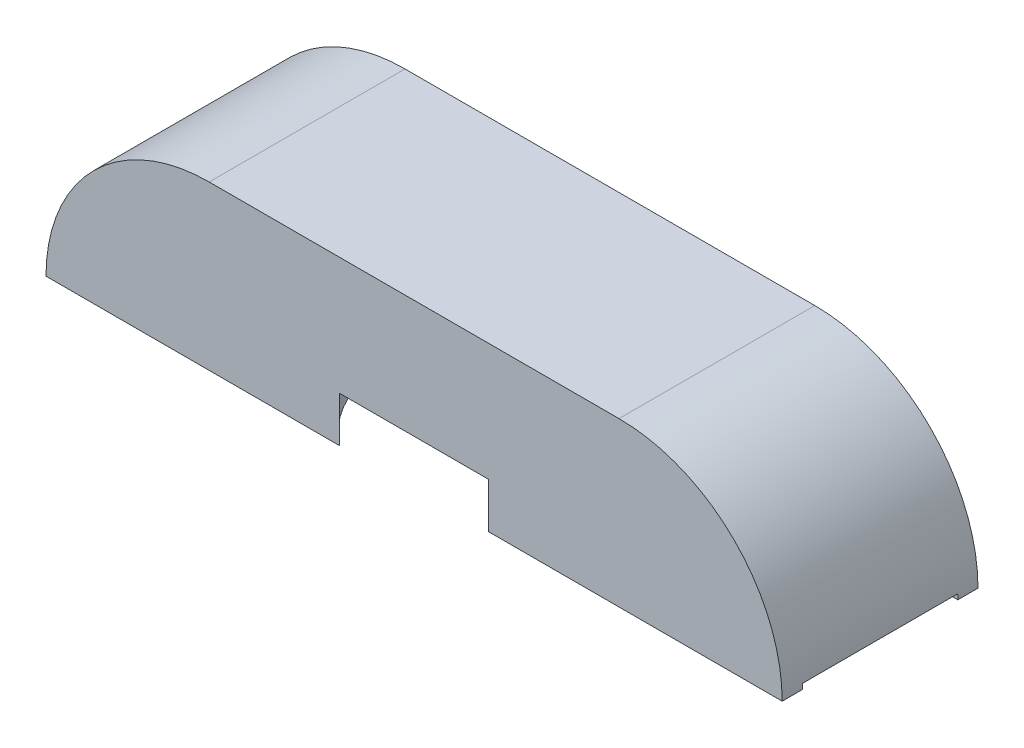
ISO-10303-21;
HEADER;
FILE_DESCRIPTION(('STEP AP214'),'2;1');
FILE_NAME('part.step','',(''),(''),'','','');
FILE_SCHEMA(('AUTOMOTIVE_DESIGN { 1 0 10303 214 1 1 1 1 }'));
ENDSEC;
DATA;
#1=APPLICATION_CONTEXT('core data for automotive mechanical design processes');
#2=APPLICATION_PROTOCOL_DEFINITION('international standard','automotive_design',2000,#1);
#3=PRODUCT_CONTEXT('',#1,'mechanical');
#4=PRODUCT('Part','Part','',(#3));
#5=PRODUCT_RELATED_PRODUCT_CATEGORY('part','',(#4));
#6=PRODUCT_DEFINITION_FORMATION('','',#4);
#7=PRODUCT_DEFINITION_CONTEXT('part definition',#1,'design');
#8=PRODUCT_DEFINITION('design','',#6,#7);
#9=PRODUCT_DEFINITION_SHAPE('','',#8);
#10=(LENGTH_UNIT() NAMED_UNIT(*) SI_UNIT(.MILLI.,.METRE.));
#11=(NAMED_UNIT(*) PLANE_ANGLE_UNIT() SI_UNIT($,.RADIAN.));
#12=(NAMED_UNIT(*) SI_UNIT($,.STERADIAN.) SOLID_ANGLE_UNIT());
#13=UNCERTAINTY_MEASURE_WITH_UNIT(LENGTH_MEASURE(1.E-05),#10,'distance_accuracy_value','');
#14=(GEOMETRIC_REPRESENTATION_CONTEXT(3) GLOBAL_UNCERTAINTY_ASSIGNED_CONTEXT((#13)) GLOBAL_UNIT_ASSIGNED_CONTEXT((#10,
#11,#12)) REPRESENTATION_CONTEXT('',''));
#15=CARTESIAN_POINT('',(0.,0.,0.));
#16=DIRECTION('',(0.,0.,1.));
#17=DIRECTION('',(1.,0.,0.));
#18=AXIS2_PLACEMENT_3D('',#15,#16,#17);
#19=CARTESIAN_POINT('',(0.,0.,0.));
#20=DIRECTION('',(0.,1.,0.));
#21=DIRECTION('',(0.,0.,1.));
#22=AXIS2_PLACEMENT_3D('',#19,#20,#21);
#23=PLANE('',#22);
#24=DIRECTION('',(1.,0.,0.));
#25=VECTOR('',#24,1.);
#26=CARTESIAN_POINT('',(-45.115,0.,12.));
#27=LINE('',#26,#25);
#28=CARTESIAN_POINT('',(9.1327104410465,0.,12.));
#29=VERTEX_POINT('',#28);
#30=CARTESIAN_POINT('',(45.115,0.,12.));
#31=VERTEX_POINT('',#30);
#32=EDGE_CURVE('E237',#29,#31,#27,.T.);
#33=ORIENTED_EDGE('',*,*,#32,.F.);
#34=CARTESIAN_POINT('',(0.,0.,0.));
#35=DIRECTION('',(0.,-1.,0.));
#36=DIRECTION('',(0.,0.,-1.));
#37=AXIS2_PLACEMENT_3D('',#34,#35,#36);
#38=CIRCLE('',#37,15.08);
#39=CARTESIAN_POINT('',(9.13271044104651,0.,-12.));
#40=VERTEX_POINT('',#39);
#41=EDGE_CURVE('E295',#40,#29,#38,.T.);
#42=ORIENTED_EDGE('',*,*,#41,.F.);
#43=DIRECTION('',(-1.,0.,0.));
#44=VECTOR('',#43,1.);
#45=CARTESIAN_POINT('',(-45.115,0.,-12.));
#46=LINE('',#45,#44);
#47=CARTESIAN_POINT('',(45.115,0.,-12.));
#48=VERTEX_POINT('',#47);
#49=EDGE_CURVE('E166',#48,#40,#46,.T.);
#50=ORIENTED_EDGE('',*,*,#49,.F.);
#51=DIRECTION('',(0.,0.,-1.));
#52=VECTOR('',#51,1.);
#53=CARTESIAN_POINT('',(45.115,0.,-12.));
#54=LINE('',#53,#52);
#55=CARTESIAN_POINT('',(45.115,0.,-9.525));
#56=VERTEX_POINT('',#55);
#57=EDGE_CURVE('E213',#56,#48,#54,.T.);
#58=ORIENTED_EDGE('',*,*,#57,.F.);
#59=DIRECTION('',(1.,0.,0.));
#60=VECTOR('',#59,1.);
#61=CARTESIAN_POINT('',(45.115,0.,-9.525));
#62=LINE('',#61,#60);
#63=CARTESIAN_POINT('',(38.635,0.,-9.525));
#64=VERTEX_POINT('',#63);
#65=EDGE_CURVE('E195',#64,#56,#62,.T.);
#66=ORIENTED_EDGE('',*,*,#65,.F.);
#67=DIRECTION('',(0.,0.,-1.));
#68=VECTOR('',#67,1.);
#69=CARTESIAN_POINT('',(38.635,0.,9.525));
#70=LINE('',#69,#68);
#71=CARTESIAN_POINT('',(38.635,0.,9.525));
#72=VERTEX_POINT('',#71);
#73=EDGE_CURVE('E204',#72,#64,#70,.T.);
#74=ORIENTED_EDGE('',*,*,#73,.F.);
#75=DIRECTION('',(-1.,0.,0.));
#76=VECTOR('',#75,1.);
#77=CARTESIAN_POINT('',(45.115,0.,9.525));
#78=LINE('',#77,#76);
#79=CARTESIAN_POINT('',(45.115,0.,9.525));
#80=VERTEX_POINT('',#79);
#81=EDGE_CURVE('E190',#80,#72,#78,.T.);
#82=ORIENTED_EDGE('',*,*,#81,.F.);
#83=EDGE_CURVE('E226',#31,#80,#54,.T.);
#84=ORIENTED_EDGE('',*,*,#83,.F.);
#85=EDGE_LOOP('',(#33,#42,#50,#58,#66,#74,#82,#84));
#86=FACE_BOUND('',#85,.T.);
#87=ADVANCED_FACE('F43',(#86),#23,.F.);
#88=CARTESIAN_POINT('',(-45.115,20.,-12.));
#89=DIRECTION('',(0.,0.,1.));
#90=DIRECTION('',(1.,0.,0.));
#91=AXIS2_PLACEMENT_3D('',#88,#89,#90);
#92=PLANE('',#91);
#93=DIRECTION('',(1.,0.,0.));
#94=VECTOR('',#93,1.);
#95=CARTESIAN_POINT('',(-45.115,5.56,-12.));
#96=LINE('',#95,#94);
#97=CARTESIAN_POINT('',(-9.13271044104651,5.56,-12.));
#98=VERTEX_POINT('',#97);
#99=CARTESIAN_POINT('',(9.13271044104651,5.56,-12.));
#100=VERTEX_POINT('',#99);
#101=EDGE_CURVE('E141',#98,#100,#96,.T.);
#102=ORIENTED_EDGE('',*,*,#101,.F.);
#103=DIRECTION('',(0.,-1.,0.));
#104=VECTOR('',#103,1.);
#105=CARTESIAN_POINT('',(-9.13271044104651,5.56,-12.));
#106=LINE('',#105,#104);
#107=CARTESIAN_POINT('',(-9.13271044104651,0.,-12.));
#108=VERTEX_POINT('',#107);
#109=EDGE_CURVE('E152',#98,#108,#106,.T.);
#110=ORIENTED_EDGE('',*,*,#109,.T.);
#111=CARTESIAN_POINT('',(-45.115,0.,-12.));
#112=VERTEX_POINT('',#111);
#113=EDGE_CURVE('E230',#108,#112,#46,.T.);
#114=ORIENTED_EDGE('',*,*,#113,.T.);
#115=CARTESIAN_POINT('',(-25.115,0.,-12.));
#116=DIRECTION('',(0.,0.,1.));
#117=DIRECTION('',(1.,0.,0.));
#118=AXIS2_PLACEMENT_3D('',#115,#116,#117);
#119=CIRCLE('',#118,20.);
#120=CARTESIAN_POINT('',(-25.115,20.,-12.));
#121=VERTEX_POINT('',#120);
#122=EDGE_CURVE('E248',#112,#121,#119,.F.);
#123=ORIENTED_EDGE('',*,*,#122,.T.);
#124=DIRECTION('',(-1.,0.,0.));
#125=VECTOR('',#124,1.);
#126=CARTESIAN_POINT('',(-45.115,20.,-12.));
#127=LINE('',#126,#125);
#128=CARTESIAN_POINT('',(25.115,20.,-12.));
#129=VERTEX_POINT('',#128);
#130=EDGE_CURVE('E216',#129,#121,#127,.T.);
#131=ORIENTED_EDGE('',*,*,#130,.F.);
#132=CARTESIAN_POINT('',(25.115,0.,-12.));
#133=DIRECTION('',(0.,0.,1.));
#134=DIRECTION('',(1.,0.,0.));
#135=AXIS2_PLACEMENT_3D('',#132,#133,#134);
#136=CIRCLE('',#135,20.);
#137=EDGE_CURVE('E251',#129,#48,#136,.F.);
#138=ORIENTED_EDGE('',*,*,#137,.T.);
#139=ORIENTED_EDGE('',*,*,#49,.T.);
#140=DIRECTION('',(0.,-1.,0.));
#141=VECTOR('',#140,1.);
#142=CARTESIAN_POINT('',(9.13271044104651,5.56,-12.));
#143=LINE('',#142,#141);
#144=EDGE_CURVE('E156',#40,#100,#143,.F.);
#145=ORIENTED_EDGE('',*,*,#144,.T.);
#146=EDGE_LOOP('',(#102,#110,#114,#123,#131,#138,#139,#145));
#147=FACE_BOUND('',#146,.T.);
#148=ADVANCED_FACE('F163',(#147),#92,.F.);
#149=CARTESIAN_POINT('',(-45.115,20.,12.));
#150=DIRECTION('',(0.,0.,-1.));
#151=DIRECTION('',(-1.,0.,0.));
#152=AXIS2_PLACEMENT_3D('',#149,#150,#151);
#153=PLANE('',#152);
#154=DIRECTION('',(-1.,0.,0.));
#155=VECTOR('',#154,1.);
#156=CARTESIAN_POINT('',(-45.115,5.56,12.));
#157=LINE('',#156,#155);
#158=CARTESIAN_POINT('',(9.1327104410465,5.56,12.));
#159=VERTEX_POINT('',#158);
#160=CARTESIAN_POINT('',(-9.1327104410465,5.56,12.));
#161=VERTEX_POINT('',#160);
#162=EDGE_CURVE('E11',#159,#161,#157,.T.);
#163=ORIENTED_EDGE('',*,*,#162,.F.);
#164=DIRECTION('',(0.,-1.,0.));
#165=VECTOR('',#164,1.);
#166=CARTESIAN_POINT('',(9.1327104410465,5.56,12.));
#167=LINE('',#166,#165);
#168=EDGE_CURVE('E159',#159,#29,#167,.T.);
#169=ORIENTED_EDGE('',*,*,#168,.T.);
#170=ORIENTED_EDGE('',*,*,#32,.T.);
#171=CARTESIAN_POINT('',(25.115,0.,12.));
#172=DIRECTION('',(0.,0.,-1.));
#173=DIRECTION('',(-1.,0.,0.));
#174=AXIS2_PLACEMENT_3D('',#171,#172,#173);
#175=CIRCLE('',#174,20.);
#176=CARTESIAN_POINT('',(25.115,20.,12.));
#177=VERTEX_POINT('',#176);
#178=EDGE_CURVE('E257',#31,#177,#175,.F.);
#179=ORIENTED_EDGE('',*,*,#178,.T.);
#180=DIRECTION('',(1.,0.,0.));
#181=VECTOR('',#180,1.);
#182=CARTESIAN_POINT('',(-45.115,20.,12.));
#183=LINE('',#182,#181);
#184=CARTESIAN_POINT('',(-25.115,20.,12.));
#185=VERTEX_POINT('',#184);
#186=EDGE_CURVE('E220',#185,#177,#183,.T.);
#187=ORIENTED_EDGE('',*,*,#186,.F.);
#188=CARTESIAN_POINT('',(-25.115,0.,12.));
#189=DIRECTION('',(0.,0.,-1.));
#190=DIRECTION('',(-1.,0.,0.));
#191=AXIS2_PLACEMENT_3D('',#188,#189,#190);
#192=CIRCLE('',#191,20.);
#193=CARTESIAN_POINT('',(-45.115,0.,12.));
#194=VERTEX_POINT('',#193);
#195=EDGE_CURVE('E254',#185,#194,#192,.F.);
#196=ORIENTED_EDGE('',*,*,#195,.T.);
#197=CARTESIAN_POINT('',(-9.1327104410465,0.,12.));
#198=VERTEX_POINT('',#197);
#199=EDGE_CURVE('E221',#194,#198,#27,.T.);
#200=ORIENTED_EDGE('',*,*,#199,.T.);
#201=DIRECTION('',(0.,-1.,0.));
#202=VECTOR('',#201,1.);
#203=CARTESIAN_POINT('',(-9.1327104410465,5.56,12.));
#204=LINE('',#203,#202);
#205=EDGE_CURVE('E59',#198,#161,#204,.F.);
#206=ORIENTED_EDGE('',*,*,#205,.T.);
#207=EDGE_LOOP('',(#163,#169,#170,#179,#187,#196,#200,#206));
#208=FACE_BOUND('',#207,.T.);
#209=ADVANCED_FACE('F275',(#208),#153,.F.);
#210=CARTESIAN_POINT('',(0.,20.,0.));
#211=DIRECTION('',(0.,1.,0.));
#212=DIRECTION('',(0.,0.,1.));
#213=AXIS2_PLACEMENT_3D('',#210,#211,#212);
#214=PLANE('',#213);
#215=ORIENTED_EDGE('',*,*,#186,.T.);
#216=DIRECTION('',(0.,0.,-1.));
#217=VECTOR('',#216,1.);
#218=CARTESIAN_POINT('',(25.115,20.,-12.));
#219=LINE('',#218,#217);
#220=EDGE_CURVE('E244',#177,#129,#219,.T.);
#221=ORIENTED_EDGE('',*,*,#220,.T.);
#222=ORIENTED_EDGE('',*,*,#130,.T.);
#223=DIRECTION('',(0.,0.,1.));
#224=VECTOR('',#223,1.);
#225=CARTESIAN_POINT('',(-25.115,20.,12.));
#226=LINE('',#225,#224);
#227=EDGE_CURVE('E225',#121,#185,#226,.T.);
#228=ORIENTED_EDGE('',*,*,#227,.T.);
#229=EDGE_LOOP('',(#215,#221,#222,#228));
#230=FACE_BOUND('',#229,.T.);
#231=ADVANCED_FACE('F281',(#230),#214,.T.);
#232=ORIENTED_EDGE('',*,*,#113,.F.);
#233=CARTESIAN_POINT('',(0.,0.,0.));
#234=DIRECTION('',(0.,1.,0.));
#235=DIRECTION('',(0.,0.,1.));
#236=AXIS2_PLACEMENT_3D('',#233,#234,#235);
#237=CIRCLE('',#236,15.08);
#238=EDGE_CURVE('E52',#108,#198,#237,.T.);
#239=ORIENTED_EDGE('',*,*,#238,.T.);
#240=ORIENTED_EDGE('',*,*,#199,.F.);
#241=DIRECTION('',(0.,0.,1.));
#242=VECTOR('',#241,1.);
#243=CARTESIAN_POINT('',(-45.115,0.,-12.));
#244=LINE('',#243,#242);
#245=EDGE_CURVE('E233',#112,#194,#244,.T.);
#246=ORIENTED_EDGE('',*,*,#245,.F.);
#247=EDGE_LOOP('',(#232,#239,#240,#246));
#248=FACE_BOUND('',#247,.T.);
#249=ADVANCED_FACE('F272',(#248),#23,.F.);
#250=CARTESIAN_POINT('',(25.115,0.,0.));
#251=DIRECTION('',(0.,0.,1.));
#252=DIRECTION('',(1.,0.,0.));
#253=AXIS2_PLACEMENT_3D('',#250,#251,#252);
#254=CYLINDRICAL_SURFACE('',#253,20.);
#255=CARTESIAN_POINT('',(25.115,0.,-9.52500000000001));
#256=DIRECTION('',(0.,0.,-1.));
#257=DIRECTION('',(-1.,0.,0.));
#258=AXIS2_PLACEMENT_3D('',#255,#256,#257);
#259=CIRCLE('',#258,20.);
#260=CARTESIAN_POINT('',(45.1047573772169,0.64,-9.525));
#261=VERTEX_POINT('',#260);
#262=EDGE_CURVE('E266',#56,#261,#259,.F.);
#263=ORIENTED_EDGE('',*,*,#262,.F.);
#264=ORIENTED_EDGE('',*,*,#57,.T.);
#265=ORIENTED_EDGE('',*,*,#137,.F.);
#266=ORIENTED_EDGE('',*,*,#220,.F.);
#267=ORIENTED_EDGE('',*,*,#178,.F.);
#268=ORIENTED_EDGE('',*,*,#83,.T.);
#269=CARTESIAN_POINT('',(25.115,0.,9.525));
#270=DIRECTION('',(0.,0.,1.));
#271=DIRECTION('',(1.,0.,0.));
#272=AXIS2_PLACEMENT_3D('',#269,#270,#271);
#273=CIRCLE('',#272,20.);
#274=CARTESIAN_POINT('',(45.1047573772169,0.64,9.525));
#275=VERTEX_POINT('',#274);
#276=EDGE_CURVE('E263',#275,#80,#273,.F.);
#277=ORIENTED_EDGE('',*,*,#276,.F.);
#278=DIRECTION('',(0.,0.,1.));
#279=VECTOR('',#278,1.);
#280=CARTESIAN_POINT('',(45.1047573772169,0.64,0.));
#281=LINE('',#280,#279);
#282=EDGE_CURVE('E260',#261,#275,#281,.T.);
#283=ORIENTED_EDGE('',*,*,#282,.F.);
#284=EDGE_LOOP('',(#263,#264,#265,#266,#267,#268,#277,#283));
#285=FACE_BOUND('',#284,.T.);
#286=ADVANCED_FACE('F289',(#285),#254,.T.);
#287=CARTESIAN_POINT('',(-25.115,0.,0.));
#288=DIRECTION('',(0.,0.,-1.));
#289=DIRECTION('',(-1.,0.,0.));
#290=AXIS2_PLACEMENT_3D('',#287,#288,#289);
#291=CYLINDRICAL_SURFACE('',#290,20.);
#292=ORIENTED_EDGE('',*,*,#122,.F.);
#293=ORIENTED_EDGE('',*,*,#245,.T.);
#294=ORIENTED_EDGE('',*,*,#195,.F.);
#295=ORIENTED_EDGE('',*,*,#227,.F.);
#296=EDGE_LOOP('',(#292,#293,#294,#295));
#297=FACE_BOUND('',#296,.T.);
#298=ADVANCED_FACE('F45',(#297),#291,.T.);
#299=CARTESIAN_POINT('',(45.115,0.64,-9.525));
#300=DIRECTION('',(0.,0.,-1.));
#301=DIRECTION('',(-1.,0.,0.));
#302=AXIS2_PLACEMENT_3D('',#299,#300,#301);
#303=PLANE('',#302);
#304=ORIENTED_EDGE('',*,*,#262,.T.);
#305=DIRECTION('',(1.,0.,0.));
#306=VECTOR('',#305,1.);
#307=CARTESIAN_POINT('',(45.115,0.64,-9.525));
#308=LINE('',#307,#306);
#309=CARTESIAN_POINT('',(38.635,0.64,-9.525));
#310=VERTEX_POINT('',#309);
#311=EDGE_CURVE('E67',#310,#261,#308,.T.);
#312=ORIENTED_EDGE('',*,*,#311,.F.);
#313=DIRECTION('',(0.,-1.,0.));
#314=VECTOR('',#313,1.);
#315=CARTESIAN_POINT('',(38.635,0.64,-9.525));
#316=LINE('',#315,#314);
#317=EDGE_CURVE('E210',#310,#64,#316,.T.);
#318=ORIENTED_EDGE('',*,*,#317,.T.);
#319=ORIENTED_EDGE('',*,*,#65,.T.);
#320=EDGE_LOOP('',(#304,#312,#318,#319));
#321=FACE_BOUND('',#320,.T.);
#322=ADVANCED_FACE('F351',(#321),#303,.F.);
#323=CARTESIAN_POINT('',(38.635,0.64,9.525));
#324=DIRECTION('',(-1.,0.,0.));
#325=DIRECTION('',(0.,0.,1.));
#326=AXIS2_PLACEMENT_3D('',#323,#324,#325);
#327=PLANE('',#326);
#328=ORIENTED_EDGE('',*,*,#73,.T.);
#329=ORIENTED_EDGE('',*,*,#317,.F.);
#330=DIRECTION('',(0.,0.,-1.));
#331=VECTOR('',#330,1.);
#332=CARTESIAN_POINT('',(38.635,0.64,9.525));
#333=LINE('',#332,#331);
#334=CARTESIAN_POINT('',(38.635,0.64,9.525));
#335=VERTEX_POINT('',#334);
#336=EDGE_CURVE('E194',#335,#310,#333,.T.);
#337=ORIENTED_EDGE('',*,*,#336,.F.);
#338=DIRECTION('',(0.,-1.,0.));
#339=VECTOR('',#338,1.);
#340=CARTESIAN_POINT('',(38.635,0.64,9.525));
#341=LINE('',#340,#339);
#342=EDGE_CURVE('E200',#335,#72,#341,.T.);
#343=ORIENTED_EDGE('',*,*,#342,.T.);
#344=EDGE_LOOP('',(#328,#329,#337,#343));
#345=FACE_BOUND('',#344,.T.);
#346=ADVANCED_FACE('F347',(#345),#327,.F.);
#347=CARTESIAN_POINT('',(45.115,0.64,9.525));
#348=DIRECTION('',(0.,0.,1.));
#349=DIRECTION('',(1.,0.,0.));
#350=AXIS2_PLACEMENT_3D('',#347,#348,#349);
#351=PLANE('',#350);
#352=ORIENTED_EDGE('',*,*,#276,.T.);
#353=ORIENTED_EDGE('',*,*,#81,.T.);
#354=ORIENTED_EDGE('',*,*,#342,.F.);
#355=DIRECTION('',(-1.,0.,0.));
#356=VECTOR('',#355,1.);
#357=CARTESIAN_POINT('',(45.115,0.64,9.525));
#358=LINE('',#357,#356);
#359=EDGE_CURVE('E191',#275,#335,#358,.T.);
#360=ORIENTED_EDGE('',*,*,#359,.F.);
#361=EDGE_LOOP('',(#352,#353,#354,#360));
#362=FACE_BOUND('',#361,.T.);
#363=ADVANCED_FACE('F343',(#362),#351,.F.);
#364=CARTESIAN_POINT('',(0.,0.64,0.));
#365=DIRECTION('',(0.,1.,0.));
#366=DIRECTION('',(0.,0.,1.));
#367=AXIS2_PLACEMENT_3D('',#364,#365,#366);
#368=PLANE('',#367);
#369=CARTESIAN_POINT('',(41.875,0.639999999999999,-5.565));
#370=DIRECTION('',(0.,-1.,0.));
#371=DIRECTION('',(0.,0.,-1.));
#372=AXIS2_PLACEMENT_3D('',#369,#370,#371);
#373=CIRCLE('',#372,1.29999999999999);
#374=CARTESIAN_POINT('',(41.875,0.639999999999999,-6.86499999999999));
#375=VERTEX_POINT('',#374);
#376=EDGE_CURVE('E151',#375,#375,#373,.T.);
#377=ORIENTED_EDGE('',*,*,#376,.F.);
#378=EDGE_LOOP('',(#377));
#379=FACE_BOUND('',#378,.T.);
#380=CARTESIAN_POINT('',(41.875,0.639999999999999,5.565));
#381=DIRECTION('',(0.,-1.,0.));
#382=DIRECTION('',(0.,0.,-1.));
#383=AXIS2_PLACEMENT_3D('',#380,#381,#382);
#384=CIRCLE('',#383,1.29999999999999);
#385=CARTESIAN_POINT('',(41.875,0.639999999999999,4.26500000000001));
#386=VERTEX_POINT('',#385);
#387=EDGE_CURVE('E182',#386,#386,#384,.T.);
#388=ORIENTED_EDGE('',*,*,#387,.F.);
#389=EDGE_LOOP('',(#388));
#390=FACE_BOUND('',#389,.T.);
#391=ORIENTED_EDGE('',*,*,#282,.T.);
#392=ORIENTED_EDGE('',*,*,#359,.T.);
#393=ORIENTED_EDGE('',*,*,#336,.T.);
#394=ORIENTED_EDGE('',*,*,#311,.T.);
#395=EDGE_LOOP('',(#391,#392,#393,#394));
#396=FACE_BOUND('',#395,.T.);
#397=ADVANCED_FACE('F346',(#379,#390,#396),#368,.F.);
#398=CARTESIAN_POINT('',(41.875,2.64,5.565));
#399=DIRECTION('',(0.,-1.,0.));
#400=DIRECTION('',(0.,0.,-1.));
#401=AXIS2_PLACEMENT_3D('',#398,#399,#400);
#402=CONICAL_SURFACE('',#401,1.29999999999999,1.02974425867665);
#403=CARTESIAN_POINT('',(41.875,3.42111880473583,5.565));
#404=VERTEX_POINT('',#403);
#405=VERTEX_LOOP('',#404);
#406=FACE_BOUND('',#405,.T.);
#407=CARTESIAN_POINT('',(41.875,2.64,5.565));
#408=DIRECTION('',(0.,-1.,0.));
#409=DIRECTION('',(0.,0.,-1.));
#410=AXIS2_PLACEMENT_3D('',#407,#408,#409);
#411=CIRCLE('',#410,1.29999999999999);
#412=CARTESIAN_POINT('',(41.875,2.64,4.26500000000001));
#413=VERTEX_POINT('',#412);
#414=EDGE_CURVE('E186',#413,#413,#411,.T.);
#415=ORIENTED_EDGE('',*,*,#414,.T.);
#416=EDGE_LOOP('',(#415));
#417=FACE_BOUND('',#416,.T.);
#418=ADVANCED_FACE('F358',(#406,#417),#402,.F.);
#419=CARTESIAN_POINT('',(41.875,0.64,5.565));
#420=DIRECTION('',(0.,-1.,0.));
#421=DIRECTION('',(0.,0.,-1.));
#422=AXIS2_PLACEMENT_3D('',#419,#420,#421);
#423=CYLINDRICAL_SURFACE('',#422,1.29999999999999);
#424=ORIENTED_EDGE('',*,*,#414,.F.);
#425=EDGE_LOOP('',(#424));
#426=FACE_BOUND('',#425,.T.);
#427=ORIENTED_EDGE('',*,*,#387,.T.);
#428=EDGE_LOOP('',(#427));
#429=FACE_BOUND('',#428,.T.);
#430=ADVANCED_FACE('F362',(#426,#429),#423,.F.);
#431=CARTESIAN_POINT('',(41.875,2.64,-5.565));
#432=DIRECTION('',(0.,-1.,0.));
#433=DIRECTION('',(0.,0.,-1.));
#434=AXIS2_PLACEMENT_3D('',#431,#432,#433);
#435=CONICAL_SURFACE('',#434,1.29999999999999,1.02974425867665);
#436=CARTESIAN_POINT('',(41.875,3.42111880473583,-5.565));
#437=VERTEX_POINT('',#436);
#438=VERTEX_LOOP('',#437);
#439=FACE_BOUND('',#438,.T.);
#440=CARTESIAN_POINT('',(41.875,2.64,-5.565));
#441=DIRECTION('',(0.,-1.,0.));
#442=DIRECTION('',(0.,0.,-1.));
#443=AXIS2_PLACEMENT_3D('',#440,#441,#442);
#444=CIRCLE('',#443,1.29999999999999);
#445=CARTESIAN_POINT('',(41.875,2.64,-6.86499999999999));
#446=VERTEX_POINT('',#445);
#447=EDGE_CURVE('E178',#446,#446,#444,.T.);
#448=ORIENTED_EDGE('',*,*,#447,.T.);
#449=EDGE_LOOP('',(#448));
#450=FACE_BOUND('',#449,.T.);
#451=ADVANCED_FACE('F322',(#439,#450),#435,.F.);
#452=CARTESIAN_POINT('',(41.875,0.64,-5.565));
#453=DIRECTION('',(0.,-1.,0.));
#454=DIRECTION('',(0.,0.,-1.));
#455=AXIS2_PLACEMENT_3D('',#452,#453,#454);
#456=CYLINDRICAL_SURFACE('',#455,1.29999999999999);
#457=ORIENTED_EDGE('',*,*,#447,.F.);
#458=EDGE_LOOP('',(#457));
#459=FACE_BOUND('',#458,.T.);
#460=ORIENTED_EDGE('',*,*,#376,.T.);
#461=EDGE_LOOP('',(#460));
#462=FACE_BOUND('',#461,.T.);
#463=ADVANCED_FACE('F315',(#459,#462),#456,.F.);
#464=CARTESIAN_POINT('',(0.,5.56,0.));
#465=DIRECTION('',(0.,-1.,0.));
#466=DIRECTION('',(0.,0.,-1.));
#467=AXIS2_PLACEMENT_3D('',#464,#465,#466);
#468=PLANE('',#467);
#469=CARTESIAN_POINT('',(0.,5.56,0.));
#470=DIRECTION('',(0.,-1.,0.));
#471=DIRECTION('',(0.,0.,-1.));
#472=AXIS2_PLACEMENT_3D('',#469,#470,#471);
#473=CIRCLE('',#472,11.905);
#474=CARTESIAN_POINT('',(0.,5.56,-11.905));
#475=VERTEX_POINT('',#474);
#476=EDGE_CURVE('E303',#475,#475,#473,.T.);
#477=ORIENTED_EDGE('',*,*,#476,.F.);
#478=EDGE_LOOP('',(#477));
#479=FACE_BOUND('',#478,.T.);
#480=ORIENTED_EDGE('',*,*,#101,.T.);
#481=CARTESIAN_POINT('',(0.,5.56,0.));
#482=DIRECTION('',(0.,-1.,0.));
#483=DIRECTION('',(0.,0.,-1.));
#484=AXIS2_PLACEMENT_3D('',#481,#482,#483);
#485=CIRCLE('',#484,15.08);
#486=EDGE_CURVE('E144',#100,#159,#485,.T.);
#487=ORIENTED_EDGE('',*,*,#486,.T.);
#488=ORIENTED_EDGE('',*,*,#162,.T.);
#489=EDGE_CURVE('E146',#161,#98,#485,.T.);
#490=ORIENTED_EDGE('',*,*,#489,.T.);
#491=EDGE_LOOP('',(#480,#487,#488,#490));
#492=FACE_BOUND('',#491,.T.);
#493=ADVANCED_FACE('F143',(#479,#492),#468,.T.);
#494=CARTESIAN_POINT('',(0.,5.56,0.));
#495=DIRECTION('',(0.,-1.,0.));
#496=DIRECTION('',(0.,0.,-1.));
#497=AXIS2_PLACEMENT_3D('',#494,#495,#496);
#498=CYLINDRICAL_SURFACE('',#497,15.08);
#499=ORIENTED_EDGE('',*,*,#489,.F.);
#500=ORIENTED_EDGE('',*,*,#205,.F.);
#501=ORIENTED_EDGE('',*,*,#238,.F.);
#502=ORIENTED_EDGE('',*,*,#109,.F.);
#503=EDGE_LOOP('',(#499,#500,#501,#502));
#504=FACE_BOUND('',#503,.T.);
#505=ADVANCED_FACE('F314',(#504),#498,.F.);
#506=ORIENTED_EDGE('',*,*,#41,.T.);
#507=ORIENTED_EDGE('',*,*,#168,.F.);
#508=ORIENTED_EDGE('',*,*,#486,.F.);
#509=ORIENTED_EDGE('',*,*,#144,.F.);
#510=EDGE_LOOP('',(#506,#507,#508,#509));
#511=FACE_BOUND('',#510,.T.);
#512=ADVANCED_FACE('F155',(#511),#498,.F.);
#513=CARTESIAN_POINT('',(0.,16.66,0.));
#514=DIRECTION('',(0.,-1.,0.));
#515=DIRECTION('',(0.,0.,-1.));
#516=AXIS2_PLACEMENT_3D('',#513,#514,#515);
#517=CYLINDRICAL_SURFACE('',#516,11.905);
#518=CARTESIAN_POINT('',(0.,16.66,0.));
#519=DIRECTION('',(0.,-1.,0.));
#520=DIRECTION('',(0.,0.,-1.));
#521=AXIS2_PLACEMENT_3D('',#518,#519,#520);
#522=CIRCLE('',#521,11.905);
#523=CARTESIAN_POINT('',(0.,16.66,-11.905));
#524=VERTEX_POINT('',#523);
#525=EDGE_CURVE('E298',#524,#524,#522,.T.);
#526=ORIENTED_EDGE('',*,*,#525,.F.);
#527=EDGE_LOOP('',(#526));
#528=FACE_BOUND('',#527,.T.);
#529=ORIENTED_EDGE('',*,*,#476,.T.);
#530=EDGE_LOOP('',(#529));
#531=FACE_BOUND('',#530,.T.);
#532=ADVANCED_FACE('F311',(#528,#531),#517,.F.);
#533=CARTESIAN_POINT('',(0.,16.66,0.));
#534=DIRECTION('',(0.,-1.,0.));
#535=DIRECTION('',(0.,0.,-1.));
#536=AXIS2_PLACEMENT_3D('',#533,#534,#535);
#537=PLANE('',#536);
#538=ORIENTED_EDGE('',*,*,#525,.T.);
#539=EDGE_LOOP('',(#538));
#540=FACE_BOUND('',#539,.T.);
#541=ADVANCED_FACE('F446',(#540),#537,.T.);
#542=CLOSED_SHELL('',(#87,#148,#209,#231,#249,#286,#298,#322,#346,#363,#397,#418,#430,#451,#463,
#493,#505,#512,#532,#541));
#543=MANIFOLD_SOLID_BREP('B2',#542);
#544=ADVANCED_BREP_SHAPE_REPRESENTATION('',(#18,#543),#14);
#545=SHAPE_DEFINITION_REPRESENTATION(#9,#544);
ENDSEC;
END-ISO-10303-21;
